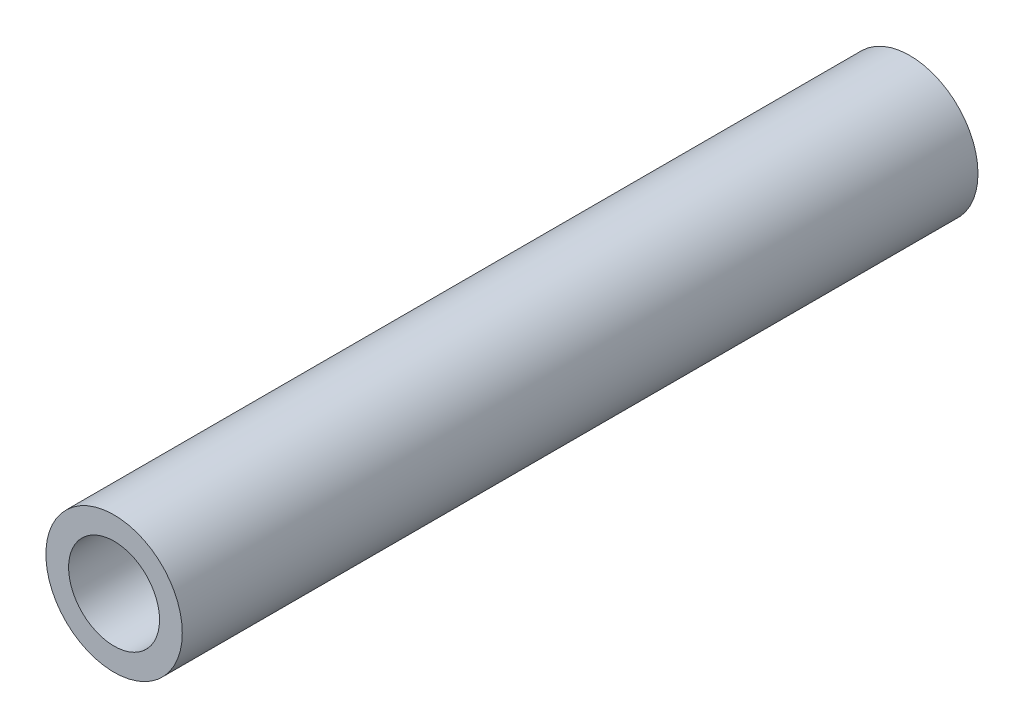
ISO-10303-21;
HEADER;
FILE_DESCRIPTION(('STEP AP214'),'2;1');
FILE_NAME('part.step','',(''),(''),'','','');
FILE_SCHEMA(('AUTOMOTIVE_DESIGN { 1 0 10303 214 1 1 1 1 }'));
ENDSEC;
DATA;
#1=APPLICATION_CONTEXT('core data for automotive mechanical design processes');
#2=APPLICATION_PROTOCOL_DEFINITION('international standard','automotive_design',2000,#1);
#3=PRODUCT_CONTEXT('',#1,'mechanical');
#4=PRODUCT('Part','Part','',(#3));
#5=PRODUCT_RELATED_PRODUCT_CATEGORY('part','',(#4));
#6=PRODUCT_DEFINITION_FORMATION('','',#4);
#7=PRODUCT_DEFINITION_CONTEXT('part definition',#1,'design');
#8=PRODUCT_DEFINITION('design','',#6,#7);
#9=PRODUCT_DEFINITION_SHAPE('','',#8);
#10=(LENGTH_UNIT() NAMED_UNIT(*) SI_UNIT(.MILLI.,.METRE.));
#11=(NAMED_UNIT(*) PLANE_ANGLE_UNIT() SI_UNIT($,.RADIAN.));
#12=(NAMED_UNIT(*) SI_UNIT($,.STERADIAN.) SOLID_ANGLE_UNIT());
#13=UNCERTAINTY_MEASURE_WITH_UNIT(LENGTH_MEASURE(1.E-05),#10,'distance_accuracy_value','');
#14=(GEOMETRIC_REPRESENTATION_CONTEXT(3) GLOBAL_UNCERTAINTY_ASSIGNED_CONTEXT((#13)) GLOBAL_UNIT_ASSIGNED_CONTEXT((#10,
#11,#12)) REPRESENTATION_CONTEXT('',''));
#15=CARTESIAN_POINT('',(0.,0.,0.));
#16=DIRECTION('',(0.,0.,1.));
#17=DIRECTION('',(1.,0.,0.));
#18=AXIS2_PLACEMENT_3D('',#15,#16,#17);
#19=CARTESIAN_POINT('',(6.,6.,35.));
#20=DIRECTION('',(0.,0.,-1.));
#21=DIRECTION('',(-1.,0.,0.));
#22=AXIS2_PLACEMENT_3D('',#19,#20,#21);
#23=CYLINDRICAL_SURFACE('',#22,3.);
#24=CARTESIAN_POINT('',(6.,6.,35.));
#25=DIRECTION('',(0.,0.,1.));
#26=DIRECTION('',(1.,0.,0.));
#27=AXIS2_PLACEMENT_3D('',#24,#25,#26);
#28=CIRCLE('',#27,3.);
#29=CARTESIAN_POINT('',(9.,6.,35.));
#30=VERTEX_POINT('',#29);
#31=EDGE_CURVE('E10',#30,#30,#28,.T.);
#32=ORIENTED_EDGE('',*,*,#31,.F.);
#33=EDGE_LOOP('',(#32));
#34=FACE_BOUND('',#33,.T.);
#35=CARTESIAN_POINT('',(6.,6.,0.));
#36=DIRECTION('',(0.,0.,1.));
#37=DIRECTION('',(1.,0.,0.));
#38=AXIS2_PLACEMENT_3D('',#35,#36,#37);
#39=CIRCLE('',#38,3.);
#40=CARTESIAN_POINT('',(9.,6.,0.));
#41=VERTEX_POINT('',#40);
#42=EDGE_CURVE('E37',#41,#41,#39,.T.);
#43=ORIENTED_EDGE('',*,*,#42,.T.);
#44=EDGE_LOOP('',(#43));
#45=FACE_BOUND('',#44,.T.);
#46=ADVANCED_FACE('F34',(#34,#45),#23,.T.);
#47=CARTESIAN_POINT('',(6.,6.,35.));
#48=DIRECTION('',(0.,0.,1.));
#49=DIRECTION('',(1.,0.,0.));
#50=AXIS2_PLACEMENT_3D('',#47,#48,#49);
#51=PLANE('',#50);
#52=CARTESIAN_POINT('',(6.,6.,35.));
#53=DIRECTION('',(0.,0.,1.));
#54=DIRECTION('',(1.,0.,0.));
#55=AXIS2_PLACEMENT_3D('',#52,#53,#54);
#56=CIRCLE('',#55,2.);
#57=CARTESIAN_POINT('',(8.,6.,35.));
#58=VERTEX_POINT('',#57);
#59=EDGE_CURVE('E46',#58,#58,#56,.T.);
#60=ORIENTED_EDGE('',*,*,#59,.F.);
#61=EDGE_LOOP('',(#60));
#62=FACE_BOUND('',#61,.T.);
#63=ORIENTED_EDGE('',*,*,#31,.T.);
#64=EDGE_LOOP('',(#63));
#65=FACE_BOUND('',#64,.T.);
#66=ADVANCED_FACE('F61',(#62,#65),#51,.T.);
#67=CARTESIAN_POINT('',(6.,6.,0.));
#68=DIRECTION('',(0.,0.,1.));
#69=DIRECTION('',(1.,0.,0.));
#70=AXIS2_PLACEMENT_3D('',#67,#68,#69);
#71=PLANE('',#70);
#72=ORIENTED_EDGE('',*,*,#42,.F.);
#73=EDGE_LOOP('',(#72));
#74=FACE_BOUND('',#73,.T.);
#75=ADVANCED_FACE('F57',(#74),#71,.F.);
#76=CARTESIAN_POINT('',(6.,6.,5.));
#77=DIRECTION('',(0.,0.,1.));
#78=DIRECTION('',(1.,0.,0.));
#79=AXIS2_PLACEMENT_3D('',#76,#77,#78);
#80=CYLINDRICAL_SURFACE('',#79,2.);
#81=CARTESIAN_POINT('',(6.,6.,5.));
#82=DIRECTION('',(0.,0.,1.));
#83=DIRECTION('',(1.,0.,0.));
#84=AXIS2_PLACEMENT_3D('',#81,#82,#83);
#85=CIRCLE('',#84,2.);
#86=CARTESIAN_POINT('',(8.,6.,5.));
#87=VERTEX_POINT('',#86);
#88=EDGE_CURVE('E44',#87,#87,#85,.T.);
#89=ORIENTED_EDGE('',*,*,#88,.F.);
#90=EDGE_LOOP('',(#89));
#91=FACE_BOUND('',#90,.T.);
#92=ORIENTED_EDGE('',*,*,#59,.T.);
#93=EDGE_LOOP('',(#92));
#94=FACE_BOUND('',#93,.T.);
#95=ADVANCED_FACE('F54',(#91,#94),#80,.F.);
#96=CARTESIAN_POINT('',(6.,6.,5.));
#97=DIRECTION('',(0.,0.,1.));
#98=DIRECTION('',(1.,0.,0.));
#99=AXIS2_PLACEMENT_3D('',#96,#97,#98);
#100=PLANE('',#99);
#101=ORIENTED_EDGE('',*,*,#88,.T.);
#102=EDGE_LOOP('',(#101));
#103=FACE_BOUND('',#102,.T.);
#104=ADVANCED_FACE('F52',(#103),#100,.T.);
#105=CLOSED_SHELL('',(#46,#66,#75,#95,#104));
#106=MANIFOLD_SOLID_BREP('B2',#105);
#107=ADVANCED_BREP_SHAPE_REPRESENTATION('',(#18,#106),#14);
#108=SHAPE_DEFINITION_REPRESENTATION(#9,#107);
ENDSEC;
END-ISO-10303-21;
